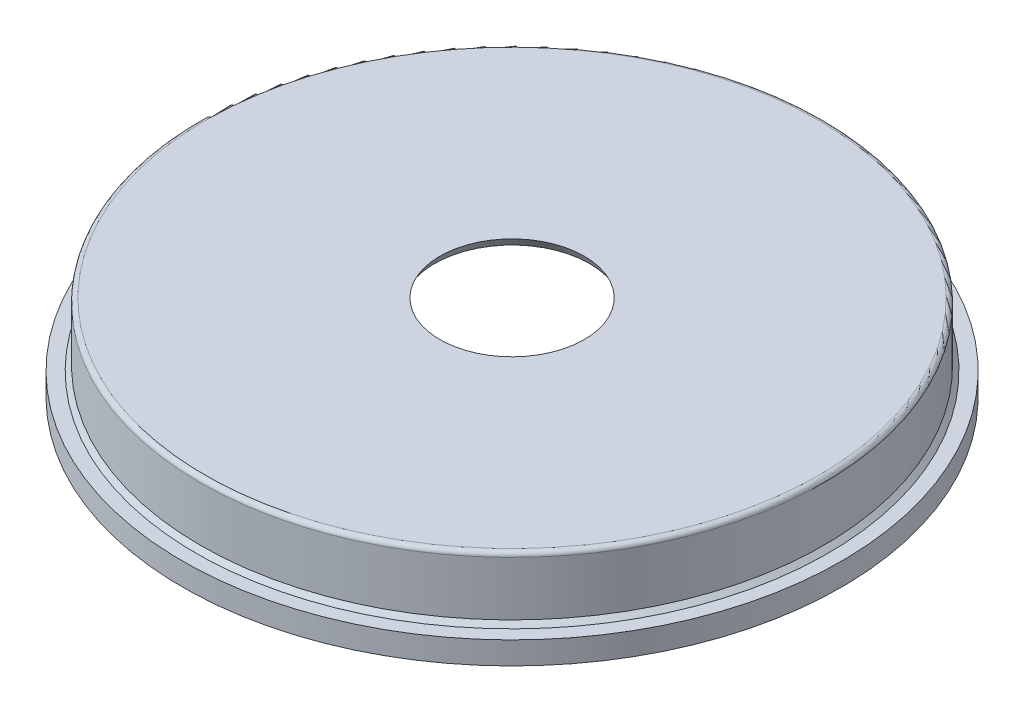
ISO-10303-21;
HEADER;
FILE_DESCRIPTION(('STEP AP214'),'2;1');
FILE_NAME('part.step','',(''),(''),'','','');
FILE_SCHEMA(('AUTOMOTIVE_DESIGN { 1 0 10303 214 1 1 1 1 }'));
ENDSEC;
DATA;
#1=APPLICATION_CONTEXT('core data for automotive mechanical design processes');
#2=APPLICATION_PROTOCOL_DEFINITION('international standard','automotive_design',2000,#1);
#3=PRODUCT_CONTEXT('',#1,'mechanical');
#4=PRODUCT('Part','Part','',(#3));
#5=PRODUCT_RELATED_PRODUCT_CATEGORY('part','',(#4));
#6=PRODUCT_DEFINITION_FORMATION('','',#4);
#7=PRODUCT_DEFINITION_CONTEXT('part definition',#1,'design');
#8=PRODUCT_DEFINITION('design','',#6,#7);
#9=PRODUCT_DEFINITION_SHAPE('','',#8);
#10=(LENGTH_UNIT() NAMED_UNIT(*) SI_UNIT(.MILLI.,.METRE.));
#11=(NAMED_UNIT(*) PLANE_ANGLE_UNIT() SI_UNIT($,.RADIAN.));
#12=(NAMED_UNIT(*) SI_UNIT($,.STERADIAN.) SOLID_ANGLE_UNIT());
#13=UNCERTAINTY_MEASURE_WITH_UNIT(LENGTH_MEASURE(1.E-05),#10,'distance_accuracy_value','');
#14=(GEOMETRIC_REPRESENTATION_CONTEXT(3) GLOBAL_UNCERTAINTY_ASSIGNED_CONTEXT((#13)) GLOBAL_UNIT_ASSIGNED_CONTEXT((#10,
#11,#12)) REPRESENTATION_CONTEXT('',''));
#15=CARTESIAN_POINT('',(0.,0.,0.));
#16=DIRECTION('',(0.,0.,1.));
#17=DIRECTION('',(1.,0.,0.));
#18=AXIS2_PLACEMENT_3D('',#15,#16,#17);
#19=CARTESIAN_POINT('',(0.,0.,0.));
#20=DIRECTION('',(0.,-1.,0.));
#21=DIRECTION('',(0.,0.,-1.));
#22=AXIS2_PLACEMENT_3D('',#19,#20,#21);
#23=CYLINDRICAL_SURFACE('',#22,73.);
#24=CARTESIAN_POINT('',(0.,0.,0.));
#25=DIRECTION('',(0.,-1.,0.));
#26=DIRECTION('',(0.,0.,-1.));
#27=AXIS2_PLACEMENT_3D('',#24,#25,#26);
#28=CIRCLE('',#27,73.);
#29=CARTESIAN_POINT('',(0.,0.,-73.));
#30=VERTEX_POINT('',#29);
#31=EDGE_CURVE('E74',#30,#30,#28,.T.);
#32=ORIENTED_EDGE('',*,*,#31,.F.);
#33=EDGE_LOOP('',(#32));
#34=FACE_BOUND('',#33,.T.);
#35=CARTESIAN_POINT('',(0.,5.,0.));
#36=DIRECTION('',(0.,-1.,0.));
#37=DIRECTION('',(0.,0.,-1.));
#38=AXIS2_PLACEMENT_3D('',#35,#36,#37);
#39=CIRCLE('',#38,73.);
#40=CARTESIAN_POINT('',(0.,5.,-73.));
#41=VERTEX_POINT('',#40);
#42=EDGE_CURVE('E10',#41,#41,#39,.T.);
#43=ORIENTED_EDGE('',*,*,#42,.T.);
#44=EDGE_LOOP('',(#43));
#45=FACE_BOUND('',#44,.T.);
#46=ADVANCED_FACE('F34',(#34,#45),#23,.T.);
#47=CARTESIAN_POINT('',(0.,5.,70.));
#48=DIRECTION('',(0.,-1.,0.));
#49=DIRECTION('',(0.,0.,-1.));
#50=AXIS2_PLACEMENT_3D('',#47,#48,#49);
#51=PLANE('',#50);
#52=ORIENTED_EDGE('',*,*,#42,.F.);
#53=EDGE_LOOP('',(#52));
#54=FACE_BOUND('',#53,.T.);
#55=CARTESIAN_POINT('',(0.,5.,0.));
#56=DIRECTION('',(0.,-1.,0.));
#57=DIRECTION('',(0.,0.,-1.));
#58=AXIS2_PLACEMENT_3D('',#55,#56,#57);
#59=CIRCLE('',#58,70.);
#60=CARTESIAN_POINT('',(0.,5.,-70.));
#61=VERTEX_POINT('',#60);
#62=EDGE_CURVE('E40',#61,#61,#59,.T.);
#63=ORIENTED_EDGE('',*,*,#62,.T.);
#64=EDGE_LOOP('',(#63));
#65=FACE_BOUND('',#64,.T.);
#66=ADVANCED_FACE('F81',(#54,#65),#51,.F.);
#67=CARTESIAN_POINT('',(0.,5.99999999999999,0.));
#68=DIRECTION('',(0.,-1.,0.));
#69=DIRECTION('',(0.,0.,-1.));
#70=AXIS2_PLACEMENT_3D('',#67,#68,#69);
#71=CONICAL_SURFACE('',#70,69.,0.785398163397451);
#72=ORIENTED_EDGE('',*,*,#62,.F.);
#73=EDGE_LOOP('',(#72));
#74=FACE_BOUND('',#73,.T.);
#75=CARTESIAN_POINT('',(0.,5.99999999999999,0.));
#76=DIRECTION('',(0.,-1.,0.));
#77=DIRECTION('',(0.,0.,-1.));
#78=AXIS2_PLACEMENT_3D('',#75,#76,#77);
#79=CIRCLE('',#78,69.);
#80=CARTESIAN_POINT('',(0.,5.99999999999999,-69.));
#81=VERTEX_POINT('',#80);
#82=EDGE_CURVE('E44',#81,#81,#79,.T.);
#83=ORIENTED_EDGE('',*,*,#82,.T.);
#84=EDGE_LOOP('',(#83));
#85=FACE_BOUND('',#84,.T.);
#86=ADVANCED_FACE('F85',(#74,#85),#71,.T.);
#87=CARTESIAN_POINT('',(0.,0.,0.));
#88=DIRECTION('',(0.,-1.,0.));
#89=DIRECTION('',(0.,0.,-1.));
#90=AXIS2_PLACEMENT_3D('',#87,#88,#89);
#91=CYLINDRICAL_SURFACE('',#90,69.);
#92=ORIENTED_EDGE('',*,*,#82,.F.);
#93=EDGE_LOOP('',(#92));
#94=FACE_BOUND('',#93,.T.);
#95=CARTESIAN_POINT('',(0.,18.,0.));
#96=DIRECTION('',(0.,-1.,0.));
#97=DIRECTION('',(0.,0.,-1.));
#98=AXIS2_PLACEMENT_3D('',#95,#96,#97);
#99=CIRCLE('',#98,69.);
#100=CARTESIAN_POINT('',(0.,18.,-69.));
#101=VERTEX_POINT('',#100);
#102=EDGE_CURVE('E48',#101,#101,#99,.T.);
#103=ORIENTED_EDGE('',*,*,#102,.T.);
#104=EDGE_LOOP('',(#103));
#105=FACE_BOUND('',#104,.T.);
#106=ADVANCED_FACE('F90',(#94,#105),#91,.T.);
#107=CARTESIAN_POINT('',(0.,18.,0.));
#108=DIRECTION('',(0.,-1.,0.));
#109=DIRECTION('',(0.,0.,-1.));
#110=AXIS2_PLACEMENT_3D('',#107,#108,#109);
#111=TOROIDAL_SURFACE('',#110,68.,1.);
#112=ORIENTED_EDGE('',*,*,#102,.F.);
#113=EDGE_LOOP('',(#112));
#114=FACE_BOUND('',#113,.T.);
#115=CARTESIAN_POINT('',(0.,19.,0.));
#116=DIRECTION('',(0.,-1.,0.));
#117=DIRECTION('',(0.,0.,-1.));
#118=AXIS2_PLACEMENT_3D('',#115,#116,#117);
#119=CIRCLE('',#118,68.);
#120=CARTESIAN_POINT('',(0.,19.,-68.));
#121=VERTEX_POINT('',#120);
#122=EDGE_CURVE('E53',#121,#121,#119,.T.);
#123=ORIENTED_EDGE('',*,*,#122,.T.);
#124=EDGE_LOOP('',(#123));
#125=FACE_BOUND('',#124,.T.);
#126=ADVANCED_FACE('F96',(#114,#125),#111,.T.);
#127=CARTESIAN_POINT('',(0.,19.,68.));
#128=DIRECTION('',(0.,-1.,0.));
#129=DIRECTION('',(0.,0.,-1.));
#130=AXIS2_PLACEMENT_3D('',#127,#128,#129);
#131=PLANE('',#130);
#132=ORIENTED_EDGE('',*,*,#122,.F.);
#133=EDGE_LOOP('',(#132));
#134=FACE_BOUND('',#133,.T.);
#135=CARTESIAN_POINT('',(0.,19.,0.));
#136=DIRECTION('',(0.,-1.,0.));
#137=DIRECTION('',(0.,0.,-1.));
#138=AXIS2_PLACEMENT_3D('',#135,#136,#137);
#139=CIRCLE('',#138,16.);
#140=CARTESIAN_POINT('',(0.,19.,-16.));
#141=VERTEX_POINT('',#140);
#142=EDGE_CURVE('E56',#141,#141,#139,.T.);
#143=ORIENTED_EDGE('',*,*,#142,.T.);
#144=EDGE_LOOP('',(#143));
#145=FACE_BOUND('',#144,.T.);
#146=ADVANCED_FACE('F100',(#134,#145),#131,.F.);
#147=CARTESIAN_POINT('',(0.,17.,0.));
#148=DIRECTION('',(0.,-1.,0.));
#149=DIRECTION('',(0.,0.,-1.));
#150=AXIS2_PLACEMENT_3D('',#147,#148,#149);
#151=CONICAL_SURFACE('',#150,17.1547005383793,0.523598775598305);
#152=ORIENTED_EDGE('',*,*,#142,.F.);
#153=EDGE_LOOP('',(#152));
#154=FACE_BOUND('',#153,.T.);
#155=CARTESIAN_POINT('',(0.,17.,0.));
#156=DIRECTION('',(0.,-1.,0.));
#157=DIRECTION('',(0.,0.,-1.));
#158=AXIS2_PLACEMENT_3D('',#155,#156,#157);
#159=CIRCLE('',#158,17.1547005383793);
#160=CARTESIAN_POINT('',(0.,17.,-17.1547005383793));
#161=VERTEX_POINT('',#160);
#162=EDGE_CURVE('E59',#161,#161,#159,.T.);
#163=ORIENTED_EDGE('',*,*,#162,.T.);
#164=EDGE_LOOP('',(#163));
#165=FACE_BOUND('',#164,.T.);
#166=ADVANCED_FACE('F104',(#154,#165),#151,.F.);
#167=CARTESIAN_POINT('',(0.,17.,17.1547005383793));
#168=DIRECTION('',(0.,1.,0.));
#169=DIRECTION('',(0.,0.,1.));
#170=AXIS2_PLACEMENT_3D('',#167,#168,#169);
#171=PLANE('',#170);
#172=ORIENTED_EDGE('',*,*,#162,.F.);
#173=EDGE_LOOP('',(#172));
#174=FACE_BOUND('',#173,.T.);
#175=CARTESIAN_POINT('',(0.,17.,0.));
#176=DIRECTION('',(0.,-1.,0.));
#177=DIRECTION('',(0.,0.,-1.));
#178=AXIS2_PLACEMENT_3D('',#175,#176,#177);
#179=CIRCLE('',#178,67.);
#180=CARTESIAN_POINT('',(0.,17.,-67.));
#181=VERTEX_POINT('',#180);
#182=EDGE_CURVE('E62',#181,#181,#179,.T.);
#183=ORIENTED_EDGE('',*,*,#182,.T.);
#184=EDGE_LOOP('',(#183));
#185=FACE_BOUND('',#184,.T.);
#186=ADVANCED_FACE('F108',(#174,#185),#171,.F.);
#187=CARTESIAN_POINT('',(0.,0.,0.));
#188=DIRECTION('',(0.,-1.,0.));
#189=DIRECTION('',(0.,0.,-1.));
#190=AXIS2_PLACEMENT_3D('',#187,#188,#189);
#191=CYLINDRICAL_SURFACE('',#190,67.);
#192=ORIENTED_EDGE('',*,*,#182,.F.);
#193=EDGE_LOOP('',(#192));
#194=FACE_BOUND('',#193,.T.);
#195=CARTESIAN_POINT('',(0.,3.,0.));
#196=DIRECTION('',(0.,-1.,0.));
#197=DIRECTION('',(0.,0.,-1.));
#198=AXIS2_PLACEMENT_3D('',#195,#196,#197);
#199=CIRCLE('',#198,67.);
#200=CARTESIAN_POINT('',(0.,3.,-67.));
#201=VERTEX_POINT('',#200);
#202=EDGE_CURVE('E65',#201,#201,#199,.T.);
#203=ORIENTED_EDGE('',*,*,#202,.T.);
#204=EDGE_LOOP('',(#203));
#205=FACE_BOUND('',#204,.T.);
#206=ADVANCED_FACE('F112',(#194,#205),#191,.F.);
#207=CARTESIAN_POINT('',(0.,3.,72.));
#208=DIRECTION('',(0.,1.,0.));
#209=DIRECTION('',(0.,0.,1.));
#210=AXIS2_PLACEMENT_3D('',#207,#208,#209);
#211=PLANE('',#210);
#212=ORIENTED_EDGE('',*,*,#202,.F.);
#213=EDGE_LOOP('',(#212));
#214=FACE_BOUND('',#213,.T.);
#215=CARTESIAN_POINT('',(0.,3.,0.));
#216=DIRECTION('',(0.,-1.,0.));
#217=DIRECTION('',(0.,0.,-1.));
#218=AXIS2_PLACEMENT_3D('',#215,#216,#217);
#219=CIRCLE('',#218,72.);
#220=CARTESIAN_POINT('',(0.,3.,-72.));
#221=VERTEX_POINT('',#220);
#222=EDGE_CURVE('E68',#221,#221,#219,.T.);
#223=ORIENTED_EDGE('',*,*,#222,.T.);
#224=EDGE_LOOP('',(#223));
#225=FACE_BOUND('',#224,.T.);
#226=ADVANCED_FACE('F116',(#214,#225),#211,.F.);
#227=CARTESIAN_POINT('',(0.,0.,0.));
#228=DIRECTION('',(0.,-1.,0.));
#229=DIRECTION('',(0.,0.,-1.));
#230=AXIS2_PLACEMENT_3D('',#227,#228,#229);
#231=CYLINDRICAL_SURFACE('',#230,72.);
#232=ORIENTED_EDGE('',*,*,#222,.F.);
#233=EDGE_LOOP('',(#232));
#234=FACE_BOUND('',#233,.T.);
#235=CARTESIAN_POINT('',(0.,0.,0.));
#236=DIRECTION('',(0.,-1.,0.));
#237=DIRECTION('',(0.,0.,-1.));
#238=AXIS2_PLACEMENT_3D('',#235,#236,#237);
#239=CIRCLE('',#238,72.);
#240=CARTESIAN_POINT('',(0.,0.,-72.));
#241=VERTEX_POINT('',#240);
#242=EDGE_CURVE('E71',#241,#241,#239,.T.);
#243=ORIENTED_EDGE('',*,*,#242,.T.);
#244=EDGE_LOOP('',(#243));
#245=FACE_BOUND('',#244,.T.);
#246=ADVANCED_FACE('F120',(#234,#245),#231,.F.);
#247=CARTESIAN_POINT('',(0.,0.,73.));
#248=DIRECTION('',(0.,1.,0.));
#249=DIRECTION('',(0.,0.,1.));
#250=AXIS2_PLACEMENT_3D('',#247,#248,#249);
#251=PLANE('',#250);
#252=ORIENTED_EDGE('',*,*,#242,.F.);
#253=EDGE_LOOP('',(#252));
#254=FACE_BOUND('',#253,.T.);
#255=ORIENTED_EDGE('',*,*,#31,.T.);
#256=EDGE_LOOP('',(#255));
#257=FACE_BOUND('',#256,.T.);
#258=ADVANCED_FACE('F78',(#254,#257),#251,.F.);
#259=CLOSED_SHELL('',(#46,#66,#86,#106,#126,#146,#166,#186,#206,#226,#246,#258));
#260=MANIFOLD_SOLID_BREP('B2',#259);
#261=ADVANCED_BREP_SHAPE_REPRESENTATION('',(#18,#260),#14);
#262=SHAPE_DEFINITION_REPRESENTATION(#9,#261);
ENDSEC;
END-ISO-10303-21;
